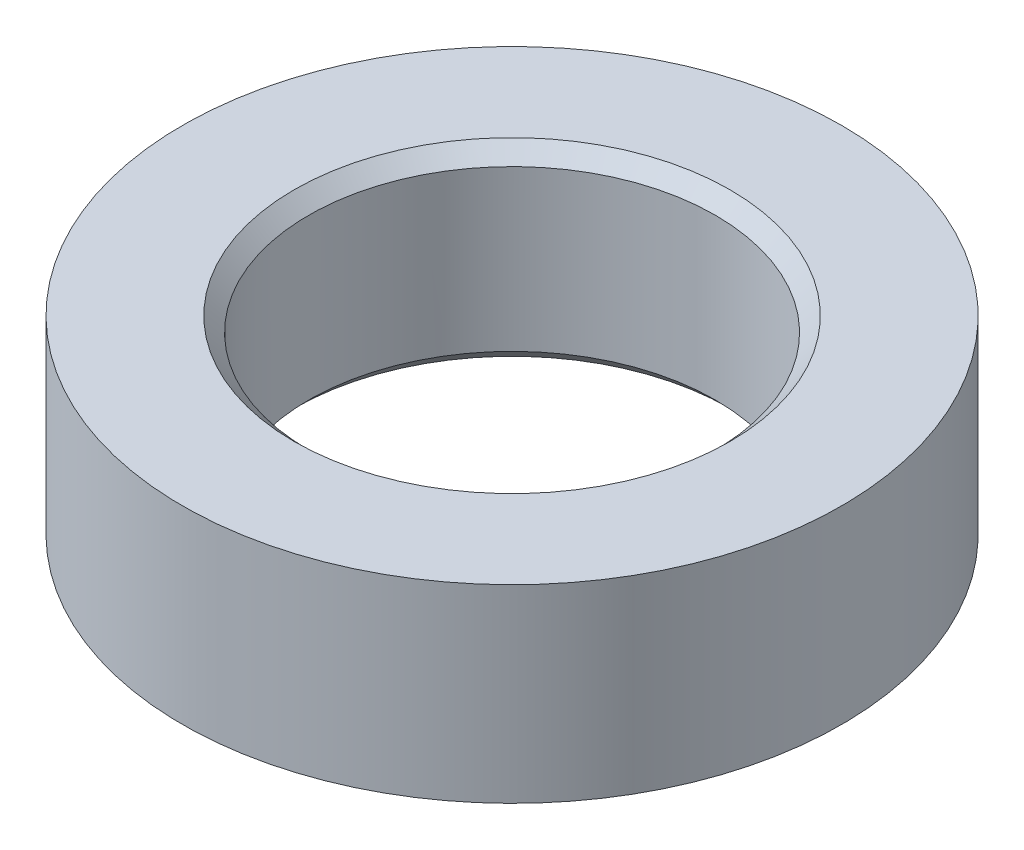
ISO-10303-21;
HEADER;
FILE_DESCRIPTION(('STEP AP214'),'2;1');
FILE_NAME('part.step','',(''),(''),'','','');
FILE_SCHEMA(('AUTOMOTIVE_DESIGN { 1 0 10303 214 1 1 1 1 }'));
ENDSEC;
DATA;
#1=APPLICATION_CONTEXT('core data for automotive mechanical design processes');
#2=APPLICATION_PROTOCOL_DEFINITION('international standard','automotive_design',2000,#1);
#3=PRODUCT_CONTEXT('',#1,'mechanical');
#4=PRODUCT('Part','Part','',(#3));
#5=PRODUCT_RELATED_PRODUCT_CATEGORY('part','',(#4));
#6=PRODUCT_DEFINITION_FORMATION('','',#4);
#7=PRODUCT_DEFINITION_CONTEXT('part definition',#1,'design');
#8=PRODUCT_DEFINITION('design','',#6,#7);
#9=PRODUCT_DEFINITION_SHAPE('','',#8);
#10=(LENGTH_UNIT() NAMED_UNIT(*) SI_UNIT(.MILLI.,.METRE.));
#11=(NAMED_UNIT(*) PLANE_ANGLE_UNIT() SI_UNIT($,.RADIAN.));
#12=(NAMED_UNIT(*) SI_UNIT($,.STERADIAN.) SOLID_ANGLE_UNIT());
#13=UNCERTAINTY_MEASURE_WITH_UNIT(LENGTH_MEASURE(1.E-05),#10,'distance_accuracy_value','');
#14=(GEOMETRIC_REPRESENTATION_CONTEXT(3) GLOBAL_UNCERTAINTY_ASSIGNED_CONTEXT((#13)) GLOBAL_UNIT_ASSIGNED_CONTEXT((#10,
#11,#12)) REPRESENTATION_CONTEXT('',''));
#15=CARTESIAN_POINT('',(0.,0.,0.));
#16=DIRECTION('',(0.,0.,1.));
#17=DIRECTION('',(1.,0.,0.));
#18=AXIS2_PLACEMENT_3D('',#15,#16,#17);
#19=CARTESIAN_POINT('',(0.,6.45,0.));
#20=DIRECTION('',(0.,1.,0.));
#21=DIRECTION('',(0.,0.,1.));
#22=AXIS2_PLACEMENT_3D('',#19,#20,#21);
#23=PLANE('',#22);
#24=CARTESIAN_POINT('',(0.,6.45,0.));
#25=DIRECTION('',(0.,1.,0.));
#26=DIRECTION('',(0.,0.,1.));
#27=AXIS2_PLACEMENT_3D('',#24,#25,#26);
#28=CIRCLE('',#27,7.42500000000001);
#29=CARTESIAN_POINT('',(0.,6.45,7.42500000000001));
#30=VERTEX_POINT('',#29);
#31=EDGE_CURVE('E10',#30,#30,#28,.F.);
#32=ORIENTED_EDGE('',*,*,#31,.T.);
#33=EDGE_LOOP('',(#32));
#34=FACE_BOUND('',#33,.T.);
#35=CARTESIAN_POINT('',(0.,6.45,0.));
#36=DIRECTION('',(0.,1.,0.));
#37=DIRECTION('',(0.,0.,1.));
#38=AXIS2_PLACEMENT_3D('',#35,#36,#37);
#39=CIRCLE('',#38,11.225);
#40=CARTESIAN_POINT('',(0.,6.45,-11.225));
#41=VERTEX_POINT('',#40);
#42=EDGE_CURVE('E52',#41,#41,#39,.T.);
#43=ORIENTED_EDGE('',*,*,#42,.T.);
#44=EDGE_LOOP('',(#43));
#45=FACE_BOUND('',#44,.T.);
#46=ADVANCED_FACE('F32',(#34,#45),#23,.T.);
#47=CARTESIAN_POINT('',(0.,0.,0.));
#48=DIRECTION('',(0.,1.,0.));
#49=DIRECTION('',(0.,0.,1.));
#50=AXIS2_PLACEMENT_3D('',#47,#48,#49);
#51=PLANE('',#50);
#52=CARTESIAN_POINT('',(0.,0.,0.));
#53=DIRECTION('',(0.,1.,0.));
#54=DIRECTION('',(0.,0.,1.));
#55=AXIS2_PLACEMENT_3D('',#52,#53,#54);
#56=CIRCLE('',#55,7.42499999999999);
#57=CARTESIAN_POINT('',(0.,0.,7.42499999999999));
#58=VERTEX_POINT('',#57);
#59=EDGE_CURVE('E47',#58,#58,#56,.T.);
#60=ORIENTED_EDGE('',*,*,#59,.T.);
#61=EDGE_LOOP('',(#60));
#62=FACE_BOUND('',#61,.T.);
#63=CARTESIAN_POINT('',(0.,0.,0.));
#64=DIRECTION('',(0.,1.,0.));
#65=DIRECTION('',(0.,0.,1.));
#66=AXIS2_PLACEMENT_3D('',#63,#64,#65);
#67=CIRCLE('',#66,11.225);
#68=CARTESIAN_POINT('',(0.,0.,-11.225));
#69=VERTEX_POINT('',#68);
#70=EDGE_CURVE('E53',#69,#69,#67,.T.);
#71=ORIENTED_EDGE('',*,*,#70,.F.);
#72=EDGE_LOOP('',(#71));
#73=FACE_BOUND('',#72,.T.);
#74=ADVANCED_FACE('F64',(#62,#73),#51,.F.);
#75=CARTESIAN_POINT('',(0.,6.45,0.));
#76=DIRECTION('',(0.,-1.,0.));
#77=DIRECTION('',(0.,0.,-1.));
#78=AXIS2_PLACEMENT_3D('',#75,#76,#77);
#79=CYLINDRICAL_SURFACE('',#78,11.225);
#80=CARTESIAN_POINT('',(0.,6.45,-11.225));
#81=CARTESIAN_POINT('',(0.,6.3828125,-11.225));
#82=CARTESIAN_POINT('',(0.,6.315625,-11.225));
#83=CARTESIAN_POINT('',(0.,6.18125,-11.225));
#84=CARTESIAN_POINT('',(0.,6.1140625,-11.225));
#85=CARTESIAN_POINT('',(0.,5.9796875,-11.225));
#86=CARTESIAN_POINT('',(0.,5.9125,-11.225));
#87=CARTESIAN_POINT('',(0.,5.778125,-11.225));
#88=CARTESIAN_POINT('',(0.,5.7109375,-11.225));
#89=CARTESIAN_POINT('',(0.,5.5765625,-11.225));
#90=CARTESIAN_POINT('',(0.,5.509375,-11.225));
#91=CARTESIAN_POINT('',(0.,5.375,-11.225));
#92=CARTESIAN_POINT('',(0.,5.3078125,-11.225));
#93=CARTESIAN_POINT('',(0.,5.1734375,-11.225));
#94=CARTESIAN_POINT('',(0.,5.10625,-11.225));
#95=CARTESIAN_POINT('',(0.,4.971875,-11.225));
#96=CARTESIAN_POINT('',(0.,4.9046875,-11.225));
#97=CARTESIAN_POINT('',(0.,4.7703125,-11.225));
#98=CARTESIAN_POINT('',(0.,4.703125,-11.225));
#99=CARTESIAN_POINT('',(0.,4.56875,-11.225));
#100=CARTESIAN_POINT('',(0.,4.5015625,-11.225));
#101=CARTESIAN_POINT('',(0.,4.3671875,-11.225));
#102=CARTESIAN_POINT('',(0.,4.3,-11.225));
#103=CARTESIAN_POINT('',(0.,4.165625,-11.225));
#104=CARTESIAN_POINT('',(0.,4.0984375,-11.225));
#105=CARTESIAN_POINT('',(0.,3.9640625,-11.225));
#106=CARTESIAN_POINT('',(0.,3.896875,-11.225));
#107=CARTESIAN_POINT('',(0.,3.7625,-11.225));
#108=CARTESIAN_POINT('',(0.,3.6953125,-11.225));
#109=CARTESIAN_POINT('',(0.,3.5609375,-11.225));
#110=CARTESIAN_POINT('',(0.,3.49375,-11.225));
#111=CARTESIAN_POINT('',(0.,3.359375,-11.225));
#112=CARTESIAN_POINT('',(0.,3.2921875,-11.225));
#113=CARTESIAN_POINT('',(0.,3.1578125,-11.225));
#114=CARTESIAN_POINT('',(0.,3.090625,-11.225));
#115=CARTESIAN_POINT('',(0.,2.95625,-11.225));
#116=CARTESIAN_POINT('',(0.,2.8890625,-11.225));
#117=CARTESIAN_POINT('',(0.,2.7546875,-11.225));
#118=CARTESIAN_POINT('',(0.,2.6875,-11.225));
#119=CARTESIAN_POINT('',(0.,2.553125,-11.225));
#120=CARTESIAN_POINT('',(0.,2.4859375,-11.225));
#121=CARTESIAN_POINT('',(0.,2.3515625,-11.225));
#122=CARTESIAN_POINT('',(0.,2.284375,-11.225));
#123=CARTESIAN_POINT('',(0.,2.15,-11.225));
#124=CARTESIAN_POINT('',(0.,2.0828125,-11.225));
#125=CARTESIAN_POINT('',(0.,1.9484375,-11.225));
#126=CARTESIAN_POINT('',(0.,1.88125,-11.225));
#127=CARTESIAN_POINT('',(0.,1.746875,-11.225));
#128=CARTESIAN_POINT('',(0.,1.6796875,-11.225));
#129=CARTESIAN_POINT('',(0.,1.5453125,-11.225));
#130=CARTESIAN_POINT('',(0.,1.478125,-11.225));
#131=CARTESIAN_POINT('',(0.,1.34375,-11.225));
#132=CARTESIAN_POINT('',(0.,1.2765625,-11.225));
#133=CARTESIAN_POINT('',(0.,1.1421875,-11.225));
#134=CARTESIAN_POINT('',(0.,1.075,-11.225));
#135=CARTESIAN_POINT('',(0.,0.940625,-11.225));
#136=CARTESIAN_POINT('',(0.,0.8734375,-11.225));
#137=CARTESIAN_POINT('',(0.,0.7390625,-11.225));
#138=CARTESIAN_POINT('',(0.,0.671875,-11.225));
#139=CARTESIAN_POINT('',(0.,0.5375,-11.225));
#140=CARTESIAN_POINT('',(0.,0.4703125,-11.225));
#141=CARTESIAN_POINT('',(0.,0.3359375,-11.225));
#142=CARTESIAN_POINT('',(0.,0.26875,-11.225));
#143=CARTESIAN_POINT('',(0.,0.134375,-11.225));
#144=CARTESIAN_POINT('',(0.,0.0671875000000002,-11.225));
#145=CARTESIAN_POINT('',(0.,0.,-11.225));
#146=B_SPLINE_CURVE_WITH_KNOTS('',3,(#80,#81,#82,#83,#84,#85,#86,#87,#88,#89,#90,#91,#92,#93,
#94,#95,#96,#97,#98,#99,#100,#101,#102,#103,#104,#105,#106,#107,#108,#109,#110,#111,#112,#113,
#114,#115,#116,#117,#118,#119,#120,#121,#122,#123,#124,#125,#126,#127,#128,#129,#130,#131,#132,
#133,#134,#135,#136,#137,#138,#139,#140,#141,#142,#143,#144,#145),.UNSPECIFIED.,.F.,.F.,(4,2,2,
2,2,2,2,2,2,2,2,2,2,2,2,2,2,2,2,2,2,2,2,2,2,2,2,2,2,2,2,2,4),(0.,0.2015625,0.403125000000001,
0.6046875,0.806250000000001,1.0078125,1.209375,1.4109375,1.6125,1.8140625,2.015625,2.2171875,
2.41875,2.6203125,2.821875,3.0234375,3.225,3.4265625,3.628125,3.8296875,4.03125,4.2328125,
4.434375,4.6359375,4.8375,5.0390625,5.240625,5.4421875,5.64375,5.8453125,6.046875,6.2484375,
6.45),.UNSPECIFIED.);
#147=EDGE_CURVE('BSEAM60',#41,#69,#146,.T.);
#148=ORIENTED_EDGE('',*,*,#42,.F.);
#149=ORIENTED_EDGE('',*,*,#70,.T.);
#150=ORIENTED_EDGE('',*,*,#147,.T.);
#151=ORIENTED_EDGE('',*,*,#147,.F.);
#152=EDGE_LOOP('',(#148,#150,#149,#151));
#153=FACE_BOUND('',#152,.T.);
#154=ADVANCED_FACE('F60',(#153),#79,.T.);
#155=CARTESIAN_POINT('',(0.,6.45,0.));
#156=DIRECTION('',(0.,-1.,0.));
#157=DIRECTION('',(0.,0.,-1.));
#158=AXIS2_PLACEMENT_3D('',#155,#156,#157);
#159=CYLINDRICAL_SURFACE('',#158,6.925);
#160=CARTESIAN_POINT('',(0.,0.49999999999999,0.));
#161=DIRECTION('',(0.,1.,0.));
#162=DIRECTION('',(0.,0.,1.));
#163=AXIS2_PLACEMENT_3D('',#160,#161,#162);
#164=CIRCLE('',#163,6.925);
#165=CARTESIAN_POINT('',(0.,0.49999999999999,-6.925));
#166=VERTEX_POINT('',#165);
#167=EDGE_CURVE('E39',#166,#166,#164,.F.);
#168=CARTESIAN_POINT('',(0.,5.94999999999999,0.));
#169=DIRECTION('',(0.,1.,0.));
#170=DIRECTION('',(0.,0.,1.));
#171=AXIS2_PLACEMENT_3D('',#168,#169,#170);
#172=CIRCLE('',#171,6.925);
#173=CARTESIAN_POINT('',(0.,5.94999999999999,-6.925));
#174=VERTEX_POINT('',#173);
#175=EDGE_CURVE('E43',#174,#174,#172,.T.);
#176=CARTESIAN_POINT('',(0.,0.49999999999999,-6.925));
#177=CARTESIAN_POINT('',(0.,0.556770833333324,-6.925));
#178=CARTESIAN_POINT('',(0.,0.613541666666657,-6.925));
#179=CARTESIAN_POINT('',(0.,0.727083333333324,-6.925));
#180=CARTESIAN_POINT('',(0.,0.783854166666657,-6.925));
#181=CARTESIAN_POINT('',(0.,0.897395833333323,-6.925));
#182=CARTESIAN_POINT('',(0.,0.954166666666656,-6.925));
#183=CARTESIAN_POINT('',(0.,1.06770833333332,-6.925));
#184=CARTESIAN_POINT('',(0.,1.12447916666666,-6.925));
#185=CARTESIAN_POINT('',(0.,1.23802083333332,-6.925));
#186=CARTESIAN_POINT('',(0.,1.29479166666666,-6.925));
#187=CARTESIAN_POINT('',(0.,1.40833333333332,-6.925));
#188=CARTESIAN_POINT('',(0.,1.46510416666666,-6.925));
#189=CARTESIAN_POINT('',(0.,1.57864583333332,-6.925));
#190=CARTESIAN_POINT('',(0.,1.63541666666666,-6.925));
#191=CARTESIAN_POINT('',(0.,1.74895833333332,-6.925));
#192=CARTESIAN_POINT('',(0.,1.80572916666666,-6.925));
#193=CARTESIAN_POINT('',(0.,1.91927083333332,-6.925));
#194=CARTESIAN_POINT('',(0.,1.97604166666666,-6.925));
#195=CARTESIAN_POINT('',(0.,2.08958333333332,-6.925));
#196=CARTESIAN_POINT('',(0.,2.14635416666666,-6.925));
#197=CARTESIAN_POINT('',(0.,2.25989583333332,-6.925));
#198=CARTESIAN_POINT('',(0.,2.31666666666666,-6.925));
#199=CARTESIAN_POINT('',(0.,2.43020833333332,-6.925));
#200=CARTESIAN_POINT('',(0.,2.48697916666665,-6.925));
#201=CARTESIAN_POINT('',(0.,2.60052083333332,-6.925));
#202=CARTESIAN_POINT('',(0.,2.65729166666666,-6.925));
#203=CARTESIAN_POINT('',(0.,2.77083333333332,-6.925));
#204=CARTESIAN_POINT('',(0.,2.82760416666665,-6.925));
#205=CARTESIAN_POINT('',(0.,2.94114583333332,-6.925));
#206=CARTESIAN_POINT('',(0.,2.99791666666665,-6.925));
#207=CARTESIAN_POINT('',(0.,3.11145833333332,-6.925));
#208=CARTESIAN_POINT('',(0.,3.16822916666665,-6.925));
#209=CARTESIAN_POINT('',(0.,3.28177083333332,-6.925));
#210=CARTESIAN_POINT('',(0.,3.33854166666665,-6.925));
#211=CARTESIAN_POINT('',(0.,3.45208333333332,-6.925));
#212=CARTESIAN_POINT('',(0.,3.50885416666665,-6.925));
#213=CARTESIAN_POINT('',(0.,3.62239583333332,-6.925));
#214=CARTESIAN_POINT('',(0.,3.67916666666665,-6.925));
#215=CARTESIAN_POINT('',(0.,3.79270833333332,-6.925));
#216=CARTESIAN_POINT('',(0.,3.84947916666665,-6.925));
#217=CARTESIAN_POINT('',(0.,3.96302083333332,-6.925));
#218=CARTESIAN_POINT('',(0.,4.01979166666665,-6.925));
#219=CARTESIAN_POINT('',(0.,4.13333333333332,-6.925));
#220=CARTESIAN_POINT('',(0.,4.19010416666665,-6.925));
#221=CARTESIAN_POINT('',(0.,4.30364583333332,-6.925));
#222=CARTESIAN_POINT('',(0.,4.36041666666665,-6.925));
#223=CARTESIAN_POINT('',(0.,4.47395833333332,-6.925));
#224=CARTESIAN_POINT('',(0.,4.53072916666665,-6.925));
#225=CARTESIAN_POINT('',(0.,4.64427083333332,-6.925));
#226=CARTESIAN_POINT('',(0.,4.70104166666665,-6.925));
#227=CARTESIAN_POINT('',(0.,4.81458333333332,-6.925));
#228=CARTESIAN_POINT('',(0.,4.87135416666665,-6.925));
#229=CARTESIAN_POINT('',(0.,4.98489583333332,-6.925));
#230=CARTESIAN_POINT('',(0.,5.04166666666665,-6.925));
#231=CARTESIAN_POINT('',(0.,5.15520833333332,-6.925));
#232=CARTESIAN_POINT('',(0.,5.21197916666665,-6.925));
#233=CARTESIAN_POINT('',(0.,5.32552083333332,-6.925));
#234=CARTESIAN_POINT('',(0.,5.38229166666665,-6.925));
#235=CARTESIAN_POINT('',(0.,5.49583333333332,-6.925));
#236=CARTESIAN_POINT('',(0.,5.55260416666665,-6.925));
#237=CARTESIAN_POINT('',(0.,5.66614583333332,-6.925));
#238=CARTESIAN_POINT('',(0.,5.72291666666665,-6.925));
#239=CARTESIAN_POINT('',(0.,5.83645833333332,-6.925));
#240=CARTESIAN_POINT('',(0.,5.89322916666665,-6.925));
#241=CARTESIAN_POINT('',(0.,5.94999999999999,-6.925));
#242=B_SPLINE_CURVE_WITH_KNOTS('',3,(#176,#177,#178,#179,#180,#181,#182,#183,#184,#185,#186,
#187,#188,#189,#190,#191,#192,#193,#194,#195,#196,#197,#198,#199,#200,#201,#202,#203,#204,#205,
#206,#207,#208,#209,#210,#211,#212,#213,#214,#215,#216,#217,#218,#219,#220,#221,#222,#223,#224,
#225,#226,#227,#228,#229,#230,#231,#232,#233,#234,#235,#236,#237,#238,#239,#240,#241),
.UNSPECIFIED.,.F.,.F.,(4,2,2,2,2,2,2,2,2,2,2,2,2,2,2,2,2,2,2,2,2,2,2,2,2,2,2,2,2,2,2,2,4),(0.,
0.1703125,0.340625,0.510937499999999,0.68125,0.8515625,1.021875,1.1921875,1.3625,1.5328125,
1.703125,1.8734375,2.04375,2.2140625,2.384375,2.5546875,2.725,2.8953125,3.065625,3.2359375,
3.40625,3.5765625,3.746875,3.9171875,4.0875,4.2578125,4.428125,4.5984375,4.76875,4.9390625,
5.109375,5.2796875,5.45),.UNSPECIFIED.);
#243=EDGE_CURVE('BSEAM63',#166,#174,#242,.T.);
#244=ORIENTED_EDGE('',*,*,#167,.T.);
#245=ORIENTED_EDGE('',*,*,#175,.T.);
#246=ORIENTED_EDGE('',*,*,#243,.T.);
#247=ORIENTED_EDGE('',*,*,#243,.F.);
#248=EDGE_LOOP('',(#244,#246,#245,#247));
#249=FACE_BOUND('',#248,.T.);
#250=ADVANCED_FACE('F63',(#249),#159,.F.);
#251=CARTESIAN_POINT('',(0.,0.,0.));
#252=DIRECTION('',(0.,-1.,0.));
#253=DIRECTION('',(0.,0.,-1.));
#254=AXIS2_PLACEMENT_3D('',#251,#252,#253);
#255=CONICAL_SURFACE('',#254,7.42499999999999,0.785398163397448);
#256=ORIENTED_EDGE('',*,*,#167,.F.);
#257=EDGE_LOOP('',(#256));
#258=FACE_BOUND('',#257,.T.);
#259=ORIENTED_EDGE('',*,*,#59,.F.);
#260=EDGE_LOOP('',(#259));
#261=FACE_BOUND('',#260,.T.);
#262=ADVANCED_FACE('F76',(#258,#261),#255,.F.);
#263=CARTESIAN_POINT('',(0.,5.94999999999999,0.));
#264=DIRECTION('',(0.,1.,0.));
#265=DIRECTION('',(0.,0.,1.));
#266=AXIS2_PLACEMENT_3D('',#263,#264,#265);
#267=CONICAL_SURFACE('',#266,6.925,0.785398163397448);
#268=ORIENTED_EDGE('',*,*,#31,.F.);
#269=EDGE_LOOP('',(#268));
#270=FACE_BOUND('',#269,.T.);
#271=ORIENTED_EDGE('',*,*,#175,.F.);
#272=EDGE_LOOP('',(#271));
#273=FACE_BOUND('',#272,.T.);
#274=ADVANCED_FACE('F34',(#270,#273),#267,.F.);
#275=CLOSED_SHELL('',(#46,#74,#154,#250,#262,#274));
#276=MANIFOLD_SOLID_BREP('B2',#275);
#277=ADVANCED_BREP_SHAPE_REPRESENTATION('',(#18,#276),#14);
#278=SHAPE_DEFINITION_REPRESENTATION(#9,#277);
ENDSEC;
END-ISO-10303-21;
